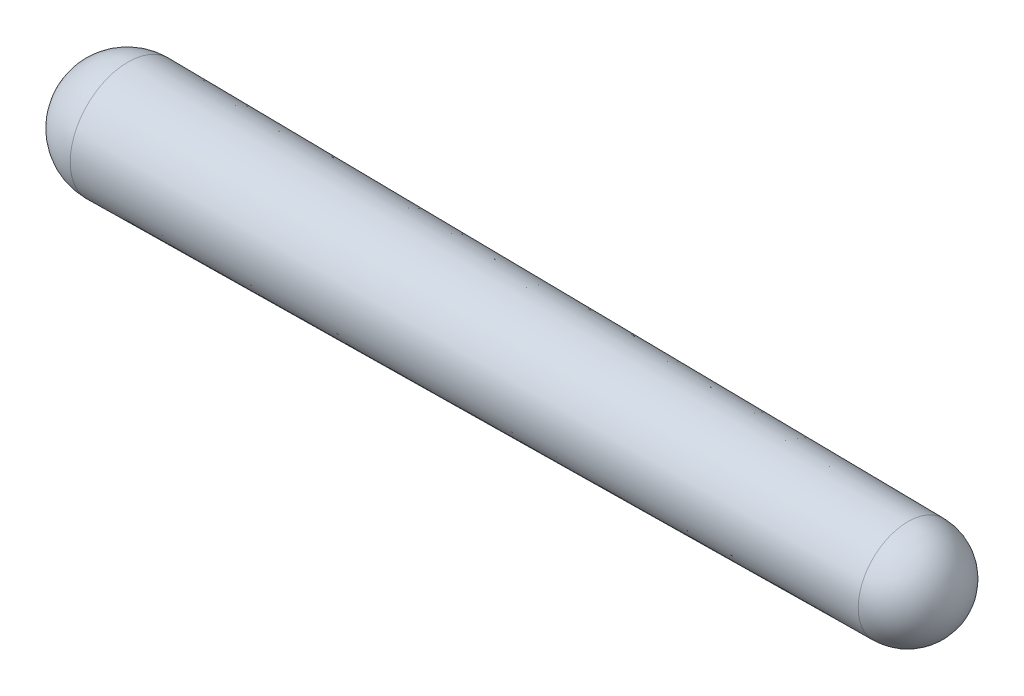
ISO-10303-21;
HEADER;
FILE_DESCRIPTION(('STEP AP214'),'2;1');
FILE_NAME('part.step','',(''),(''),'','','');
FILE_SCHEMA(('AUTOMOTIVE_DESIGN { 1 0 10303 214 1 1 1 1 }'));
ENDSEC;
DATA;
#1=APPLICATION_CONTEXT('core data for automotive mechanical design processes');
#2=APPLICATION_PROTOCOL_DEFINITION('international standard','automotive_design',2000,#1);
#3=PRODUCT_CONTEXT('',#1,'mechanical');
#4=PRODUCT('Part','Part','',(#3));
#5=PRODUCT_RELATED_PRODUCT_CATEGORY('part','',(#4));
#6=PRODUCT_DEFINITION_FORMATION('','',#4);
#7=PRODUCT_DEFINITION_CONTEXT('part definition',#1,'design');
#8=PRODUCT_DEFINITION('design','',#6,#7);
#9=PRODUCT_DEFINITION_SHAPE('','',#8);
#10=(LENGTH_UNIT() NAMED_UNIT(*) SI_UNIT(.MILLI.,.METRE.));
#11=(NAMED_UNIT(*) PLANE_ANGLE_UNIT() SI_UNIT($,.RADIAN.));
#12=(NAMED_UNIT(*) SI_UNIT($,.STERADIAN.) SOLID_ANGLE_UNIT());
#13=UNCERTAINTY_MEASURE_WITH_UNIT(LENGTH_MEASURE(1.E-05),#10,'distance_accuracy_value','');
#14=(GEOMETRIC_REPRESENTATION_CONTEXT(3) GLOBAL_UNCERTAINTY_ASSIGNED_CONTEXT((#13)) GLOBAL_UNIT_ASSIGNED_CONTEXT((#10,
#11,#12)) REPRESENTATION_CONTEXT('',''));
#15=CARTESIAN_POINT('',(0.,0.,0.));
#16=DIRECTION('',(0.,0.,1.));
#17=DIRECTION('',(1.,0.,0.));
#18=AXIS2_PLACEMENT_3D('',#15,#16,#17);
#19=CARTESIAN_POINT('',(0.,0.,0.));
#20=DIRECTION('',(-1.,0.,0.));
#21=DIRECTION('',(0.,1.,0.));
#22=AXIS2_PLACEMENT_3D('',#19,#20,#21);
#23=SPHERICAL_SURFACE('',#22,3.25);
#24=CARTESIAN_POINT('',(0.0325000000000004,0.,0.));
#25=DIRECTION('',(-1.,0.,0.));
#26=DIRECTION('',(0.,0.,1.));
#27=AXIS2_PLACEMENT_3D('',#24,#25,#26);
#28=CIRCLE('',#27,3.2498374959373);
#29=CARTESIAN_POINT('',(0.0325000000000004,0.,3.2498374959373));
#30=VERTEX_POINT('',#29);
#31=EDGE_CURVE('E50',#30,#30,#28,.T.);
#32=ORIENTED_EDGE('',*,*,#31,.T.);
#33=EDGE_LOOP('',(#32));
#34=FACE_BOUND('',#33,.T.);
#35=ADVANCED_FACE('F43',(#34),#23,.T.);
#36=CARTESIAN_POINT('',(44.,0.,0.));
#37=DIRECTION('',(-1.,0.,0.));
#38=DIRECTION('',(0.,1.,0.));
#39=AXIS2_PLACEMENT_3D('',#36,#37,#38);
#40=SPHERICAL_SURFACE('',#39,2.81);
#41=CARTESIAN_POINT('',(44.0281,0.,0.));
#42=DIRECTION('',(-1.,0.,0.));
#43=DIRECTION('',(0.,0.,1.));
#44=AXIS2_PLACEMENT_3D('',#41,#42,#43);
#45=CIRCLE('',#44,2.80985949648732);
#46=CARTESIAN_POINT('',(44.0281,0.,2.80985949648732));
#47=VERTEX_POINT('',#46);
#48=EDGE_CURVE('E10',#47,#47,#45,.T.);
#49=ORIENTED_EDGE('',*,*,#48,.F.);
#50=EDGE_LOOP('',(#49));
#51=FACE_BOUND('',#50,.T.);
#52=ADVANCED_FACE('F60',(#51),#40,.T.);
#53=CARTESIAN_POINT('',(44.0281,0.,0.));
#54=DIRECTION('',(-1.,0.,0.));
#55=DIRECTION('',(0.,0.,1.));
#56=AXIS2_PLACEMENT_3D('',#53,#54,#55);
#57=CONICAL_SURFACE('',#56,2.80985949648732,0.0100001666741671);
#58=ORIENTED_EDGE('',*,*,#31,.F.);
#59=EDGE_LOOP('',(#58));
#60=FACE_BOUND('',#59,.T.);
#61=ORIENTED_EDGE('',*,*,#48,.T.);
#62=EDGE_LOOP('',(#61));
#63=FACE_BOUND('',#62,.T.);
#64=ADVANCED_FACE('F58',(#60,#63),#57,.T.);
#65=CLOSED_SHELL('',(#35,#52,#64));
#66=MANIFOLD_SOLID_BREP('B2',#65);
#67=ADVANCED_BREP_SHAPE_REPRESENTATION('',(#18,#66),#14);
#68=SHAPE_DEFINITION_REPRESENTATION(#9,#67);
ENDSEC;
END-ISO-10303-21;
